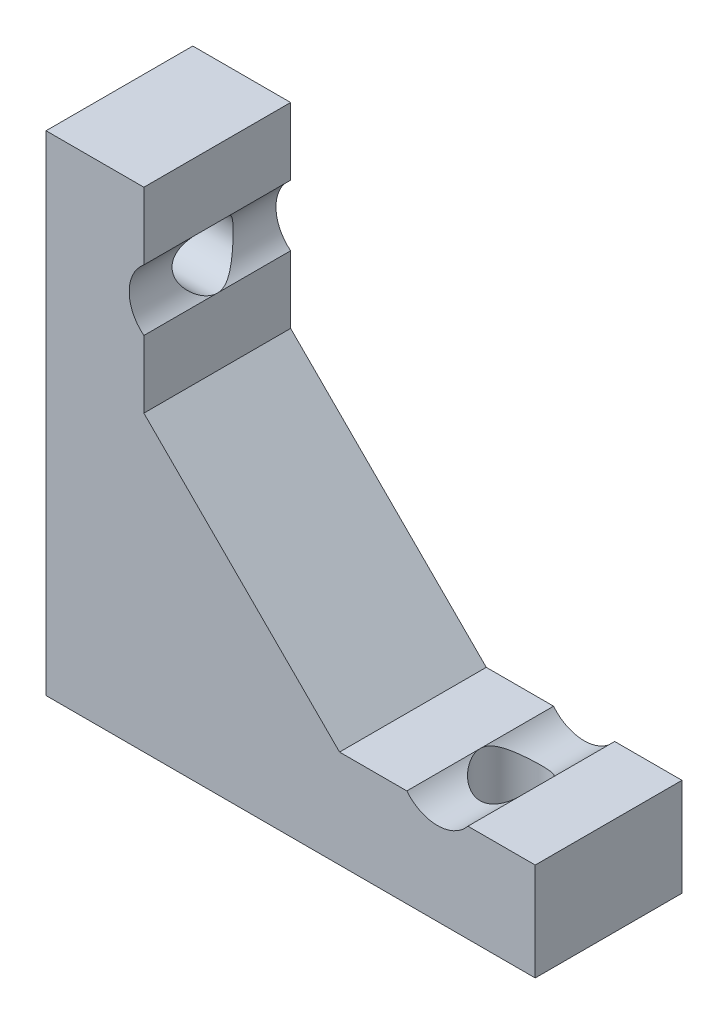
ISO-10303-21;
HEADER;
FILE_DESCRIPTION(('STEP AP214'),'2;1');
FILE_NAME('part.step','',(''),(''),'','','');
FILE_SCHEMA(('AUTOMOTIVE_DESIGN { 1 0 10303 214 1 1 1 1 }'));
ENDSEC;
DATA;
#1=APPLICATION_CONTEXT('core data for automotive mechanical design processes');
#2=APPLICATION_PROTOCOL_DEFINITION('international standard','automotive_design',2000,#1);
#3=PRODUCT_CONTEXT('',#1,'mechanical');
#4=PRODUCT('Part','Part','',(#3));
#5=PRODUCT_RELATED_PRODUCT_CATEGORY('part','',(#4));
#6=PRODUCT_DEFINITION_FORMATION('','',#4);
#7=PRODUCT_DEFINITION_CONTEXT('part definition',#1,'design');
#8=PRODUCT_DEFINITION('design','',#6,#7);
#9=PRODUCT_DEFINITION_SHAPE('','',#8);
#10=(LENGTH_UNIT() NAMED_UNIT(*) SI_UNIT(.MILLI.,.METRE.));
#11=(NAMED_UNIT(*) PLANE_ANGLE_UNIT() SI_UNIT($,.RADIAN.));
#12=(NAMED_UNIT(*) SI_UNIT($,.STERADIAN.) SOLID_ANGLE_UNIT());
#13=UNCERTAINTY_MEASURE_WITH_UNIT(LENGTH_MEASURE(1.E-05),#10,'distance_accuracy_value','');
#14=(GEOMETRIC_REPRESENTATION_CONTEXT(3) GLOBAL_UNCERTAINTY_ASSIGNED_CONTEXT((#13)) GLOBAL_UNIT_ASSIGNED_CONTEXT((#10,
#11,#12)) REPRESENTATION_CONTEXT('',''));
#15=CARTESIAN_POINT('',(0.,0.,0.));
#16=DIRECTION('',(0.,0.,1.));
#17=DIRECTION('',(1.,0.,0.));
#18=AXIS2_PLACEMENT_3D('',#15,#16,#17);
#19=CARTESIAN_POINT('',(20.,4.,6.));
#20=DIRECTION('',(0.,-1.,0.));
#21=DIRECTION('',(1.,0.,0.));
#22=AXIS2_PLACEMENT_3D('',#19,#20,#21);
#23=PLANE('',#22);
#24=DIRECTION('',(-1.,0.,0.));
#25=VECTOR('',#24,1.);
#26=CARTESIAN_POINT('',(20.,4.,0.));
#27=LINE('',#26,#25);
#28=CARTESIAN_POINT('',(20.,4.,0.));
#29=VERTEX_POINT('',#28);
#30=CARTESIAN_POINT('',(17.2489995996797,4.,0.));
#31=VERTEX_POINT('',#30);
#32=EDGE_CURVE('E281',#29,#31,#27,.T.);
#33=ORIENTED_EDGE('',*,*,#32,.T.);
#34=DIRECTION('',(0.,0.,1.));
#35=VECTOR('',#34,1.);
#36=CARTESIAN_POINT('',(17.2489995996797,4.,0.));
#37=LINE('',#36,#35);
#38=CARTESIAN_POINT('',(17.2489995996797,4.,2.95000000000002));
#39=VERTEX_POINT('',#38);
#40=EDGE_CURVE('E283',#31,#39,#37,.T.);
#41=ORIENTED_EDGE('',*,*,#40,.T.);
#42=CARTESIAN_POINT('',(16.,4.,3.));
#43=DIRECTION('',(0.,1.,0.));
#44=DIRECTION('',(-1.,0.,0.));
#45=AXIS2_PLACEMENT_3D('',#42,#43,#44);
#46=CIRCLE('',#45,1.25);
#47=CARTESIAN_POINT('',(17.2489995996797,4.,3.04999999999998));
#48=VERTEX_POINT('',#47);
#49=EDGE_CURVE('E316',#48,#39,#46,.T.);
#50=ORIENTED_EDGE('',*,*,#49,.F.);
#51=CARTESIAN_POINT('',(17.2489995996797,4.,6.));
#52=VERTEX_POINT('',#51);
#53=EDGE_CURVE('E64',#48,#52,#37,.T.);
#54=ORIENTED_EDGE('',*,*,#53,.T.);
#55=DIRECTION('',(-1.,0.,0.));
#56=VECTOR('',#55,1.);
#57=CARTESIAN_POINT('',(20.,4.,6.));
#58=LINE('',#57,#56);
#59=CARTESIAN_POINT('',(20.,4.,6.));
#60=VERTEX_POINT('',#59);
#61=EDGE_CURVE('E305',#60,#52,#58,.T.);
#62=ORIENTED_EDGE('',*,*,#61,.F.);
#63=DIRECTION('',(0.,0.,-1.));
#64=VECTOR('',#63,1.);
#65=CARTESIAN_POINT('',(20.,4.,6.));
#66=LINE('',#65,#64);
#67=EDGE_CURVE('E201',#60,#29,#66,.T.);
#68=ORIENTED_EDGE('',*,*,#67,.T.);
#69=EDGE_LOOP('',(#33,#41,#50,#54,#62,#68));
#70=FACE_BOUND('',#69,.T.);
#71=ADVANCED_FACE('F35',(#70),#23,.F.);
#72=CARTESIAN_POINT('',(4.,20.,6.));
#73=DIRECTION('',(-1.,0.,0.));
#74=DIRECTION('',(0.,-1.,0.));
#75=AXIS2_PLACEMENT_3D('',#72,#73,#74);
#76=PLANE('',#75);
#77=DIRECTION('',(0.,1.,0.));
#78=VECTOR('',#77,1.);
#79=CARTESIAN_POINT('',(4.,20.,0.));
#80=LINE('',#79,#78);
#81=CARTESIAN_POINT('',(4.,12.,0.));
#82=VERTEX_POINT('',#81);
#83=CARTESIAN_POINT('',(4.,14.7510004003203,0.));
#84=VERTEX_POINT('',#83);
#85=EDGE_CURVE('E166',#82,#84,#80,.T.);
#86=ORIENTED_EDGE('',*,*,#85,.T.);
#87=DIRECTION('',(0.,0.,1.));
#88=VECTOR('',#87,1.);
#89=CARTESIAN_POINT('',(4.,14.7510004003203,0.));
#90=LINE('',#89,#88);
#91=CARTESIAN_POINT('',(4.,14.7510004003203,2.9500000000008));
#92=VERTEX_POINT('',#91);
#93=EDGE_CURVE('E146',#84,#92,#90,.T.);
#94=ORIENTED_EDGE('',*,*,#93,.T.);
#95=CARTESIAN_POINT('',(4.,16.,3.));
#96=DIRECTION('',(1.,0.,0.));
#97=DIRECTION('',(0.,1.,0.));
#98=AXIS2_PLACEMENT_3D('',#95,#96,#97);
#99=CIRCLE('',#98,1.25);
#100=CARTESIAN_POINT('',(4.,14.7510004003203,3.0499999999992));
#101=VERTEX_POINT('',#100);
#102=EDGE_CURVE('E323',#101,#92,#99,.T.);
#103=ORIENTED_EDGE('',*,*,#102,.F.);
#104=CARTESIAN_POINT('',(4.,14.7510004003203,6.));
#105=VERTEX_POINT('',#104);
#106=EDGE_CURVE('E159',#101,#105,#90,.T.);
#107=ORIENTED_EDGE('',*,*,#106,.T.);
#108=DIRECTION('',(0.,1.,0.));
#109=VECTOR('',#108,1.);
#110=CARTESIAN_POINT('',(4.,20.,6.));
#111=LINE('',#110,#109);
#112=CARTESIAN_POINT('',(4.,12.,6.));
#113=VERTEX_POINT('',#112);
#114=EDGE_CURVE('E299',#113,#105,#111,.T.);
#115=ORIENTED_EDGE('',*,*,#114,.F.);
#116=DIRECTION('',(0.,0.,-1.));
#117=VECTOR('',#116,1.);
#118=CARTESIAN_POINT('',(4.,12.,6.));
#119=LINE('',#118,#117);
#120=EDGE_CURVE('E176',#113,#82,#119,.T.);
#121=ORIENTED_EDGE('',*,*,#120,.T.);
#122=EDGE_LOOP('',(#86,#94,#103,#107,#115,#121));
#123=FACE_BOUND('',#122,.T.);
#124=ADVANCED_FACE('F173',(#123),#76,.F.);
#125=CARTESIAN_POINT('',(0.,0.,6.));
#126=DIRECTION('',(0.,1.,0.));
#127=DIRECTION('',(0.,0.,1.));
#128=AXIS2_PLACEMENT_3D('',#125,#126,#127);
#129=PLANE('',#128);
#130=CARTESIAN_POINT('',(16.,0.,3.));
#131=DIRECTION('',(0.,1.,0.));
#132=DIRECTION('',(-1.,0.,0.));
#133=AXIS2_PLACEMENT_3D('',#130,#131,#132);
#134=CIRCLE('',#133,1.25);
#135=CARTESIAN_POINT('',(14.75,0.,3.));
#136=VERTEX_POINT('',#135);
#137=EDGE_CURVE('E295',#136,#136,#134,.T.);
#138=ORIENTED_EDGE('',*,*,#137,.T.);
#139=EDGE_LOOP('',(#138));
#140=FACE_BOUND('',#139,.T.);
#141=DIRECTION('',(1.,0.,0.));
#142=VECTOR('',#141,1.);
#143=CARTESIAN_POINT('',(0.,0.,0.));
#144=LINE('',#143,#142);
#145=CARTESIAN_POINT('',(0.,0.,0.));
#146=VERTEX_POINT('',#145);
#147=CARTESIAN_POINT('',(20.,0.,0.));
#148=VERTEX_POINT('',#147);
#149=EDGE_CURVE('E292',#146,#148,#144,.T.);
#150=ORIENTED_EDGE('',*,*,#149,.T.);
#151=DIRECTION('',(0.,0.,-1.));
#152=VECTOR('',#151,1.);
#153=CARTESIAN_POINT('',(20.,0.,6.));
#154=LINE('',#153,#152);
#155=CARTESIAN_POINT('',(20.,0.,6.));
#156=VERTEX_POINT('',#155);
#157=EDGE_CURVE('E204',#156,#148,#154,.T.);
#158=ORIENTED_EDGE('',*,*,#157,.F.);
#159=DIRECTION('',(1.,0.,0.));
#160=VECTOR('',#159,1.);
#161=CARTESIAN_POINT('',(0.,0.,6.));
#162=LINE('',#161,#160);
#163=CARTESIAN_POINT('',(0.,0.,6.));
#164=VERTEX_POINT('',#163);
#165=EDGE_CURVE('E186',#164,#156,#162,.T.);
#166=ORIENTED_EDGE('',*,*,#165,.F.);
#167=DIRECTION('',(0.,0.,-1.));
#168=VECTOR('',#167,1.);
#169=CARTESIAN_POINT('',(0.,0.,6.));
#170=LINE('',#169,#168);
#171=EDGE_CURVE('E187',#164,#146,#170,.T.);
#172=ORIENTED_EDGE('',*,*,#171,.T.);
#173=EDGE_LOOP('',(#150,#158,#166,#172));
#174=FACE_BOUND('',#173,.T.);
#175=ADVANCED_FACE('F37',(#140,#174),#129,.F.);
#176=CARTESIAN_POINT('',(20.,0.,6.));
#177=DIRECTION('',(-1.,0.,0.));
#178=DIRECTION('',(0.,0.,1.));
#179=AXIS2_PLACEMENT_3D('',#176,#177,#178);
#180=PLANE('',#179);
#181=DIRECTION('',(0.,1.,0.));
#182=VECTOR('',#181,1.);
#183=CARTESIAN_POINT('',(20.,0.,0.));
#184=LINE('',#183,#182);
#185=EDGE_CURVE('E289',#148,#29,#184,.T.);
#186=ORIENTED_EDGE('',*,*,#185,.T.);
#187=ORIENTED_EDGE('',*,*,#67,.F.);
#188=DIRECTION('',(0.,1.,0.));
#189=VECTOR('',#188,1.);
#190=CARTESIAN_POINT('',(20.,0.,6.));
#191=LINE('',#190,#189);
#192=EDGE_CURVE('E309',#156,#60,#191,.T.);
#193=ORIENTED_EDGE('',*,*,#192,.F.);
#194=ORIENTED_EDGE('',*,*,#157,.T.);
#195=EDGE_LOOP('',(#186,#187,#193,#194));
#196=FACE_BOUND('',#195,.T.);
#197=ADVANCED_FACE('F265',(#196),#180,.F.);
#198=CARTESIAN_POINT('',(14.7510004003203,4.,6.));
#199=VERTEX_POINT('',#198);
#200=CARTESIAN_POINT('',(12.,4.,6.));
#201=VERTEX_POINT('',#200);
#202=EDGE_CURVE('E308',#199,#201,#58,.T.);
#203=ORIENTED_EDGE('',*,*,#202,.F.);
#204=DIRECTION('',(0.,0.,1.));
#205=VECTOR('',#204,1.);
#206=CARTESIAN_POINT('',(14.7510004003203,4.,0.));
#207=LINE('',#206,#205);
#208=CARTESIAN_POINT('',(14.7510004003203,4.,3.04999999999998));
#209=VERTEX_POINT('',#208);
#210=EDGE_CURVE('E327',#199,#209,#207,.F.);
#211=ORIENTED_EDGE('',*,*,#210,.T.);
#212=CARTESIAN_POINT('',(14.7510004003203,4.,2.95000000000002));
#213=VERTEX_POINT('',#212);
#214=EDGE_CURVE('E313',#213,#209,#46,.T.);
#215=ORIENTED_EDGE('',*,*,#214,.F.);
#216=CARTESIAN_POINT('',(14.7510004003203,4.,0.));
#217=VERTEX_POINT('',#216);
#218=EDGE_CURVE('E56',#213,#217,#207,.F.);
#219=ORIENTED_EDGE('',*,*,#218,.T.);
#220=CARTESIAN_POINT('',(12.,4.,0.));
#221=VERTEX_POINT('',#220);
#222=EDGE_CURVE('E288',#217,#221,#27,.T.);
#223=ORIENTED_EDGE('',*,*,#222,.T.);
#224=DIRECTION('',(0.,0.,-1.));
#225=VECTOR('',#224,1.);
#226=CARTESIAN_POINT('',(12.,4.,6.));
#227=LINE('',#226,#225);
#228=EDGE_CURVE('E198',#201,#221,#227,.T.);
#229=ORIENTED_EDGE('',*,*,#228,.F.);
#230=EDGE_LOOP('',(#203,#211,#215,#219,#223,#229));
#231=FACE_BOUND('',#230,.T.);
#232=ADVANCED_FACE('F262',(#231),#23,.F.);
#233=CARTESIAN_POINT('',(4.,12.,6.));
#234=DIRECTION('',(-0.707106781186548,-0.707106781186547,0.));
#235=DIRECTION('',(0.707106781186547,-0.707106781186548,0.));
#236=AXIS2_PLACEMENT_3D('',#233,#234,#235);
#237=PLANE('',#236);
#238=DIRECTION('',(-0.707106781186548,0.707106781186548,0.));
#239=VECTOR('',#238,1.);
#240=CARTESIAN_POINT('',(4.,12.,0.));
#241=LINE('',#240,#239);
#242=EDGE_CURVE('E181',#221,#82,#241,.T.);
#243=ORIENTED_EDGE('',*,*,#242,.T.);
#244=ORIENTED_EDGE('',*,*,#120,.F.);
#245=DIRECTION('',(-0.707106781186548,0.707106781186548,0.));
#246=VECTOR('',#245,1.);
#247=CARTESIAN_POINT('',(4.,12.,6.));
#248=LINE('',#247,#246);
#249=EDGE_CURVE('E303',#201,#113,#248,.T.);
#250=ORIENTED_EDGE('',*,*,#249,.F.);
#251=ORIENTED_EDGE('',*,*,#228,.T.);
#252=EDGE_LOOP('',(#243,#244,#250,#251));
#253=FACE_BOUND('',#252,.T.);
#254=ADVANCED_FACE('F258',(#253),#237,.F.);
#255=CARTESIAN_POINT('',(4.,17.2489995996797,6.));
#256=VERTEX_POINT('',#255);
#257=CARTESIAN_POINT('',(4.,20.,6.));
#258=VERTEX_POINT('',#257);
#259=EDGE_CURVE('E302',#256,#258,#111,.T.);
#260=ORIENTED_EDGE('',*,*,#259,.F.);
#261=DIRECTION('',(0.,0.,1.));
#262=VECTOR('',#261,1.);
#263=CARTESIAN_POINT('',(4.,17.2489995996797,0.));
#264=LINE('',#263,#262);
#265=CARTESIAN_POINT('',(4.,17.2489995996797,3.0499999999985));
#266=VERTEX_POINT('',#265);
#267=EDGE_CURVE('E330',#256,#266,#264,.F.);
#268=ORIENTED_EDGE('',*,*,#267,.T.);
#269=CARTESIAN_POINT('',(4.,17.2489995996797,2.9500000000015));
#270=VERTEX_POINT('',#269);
#271=EDGE_CURVE('E320',#270,#266,#99,.T.);
#272=ORIENTED_EDGE('',*,*,#271,.F.);
#273=CARTESIAN_POINT('',(4.,17.2489995996797,0.));
#274=VERTEX_POINT('',#273);
#275=EDGE_CURVE('E157',#270,#274,#264,.F.);
#276=ORIENTED_EDGE('',*,*,#275,.T.);
#277=CARTESIAN_POINT('',(4.,20.,0.));
#278=VERTEX_POINT('',#277);
#279=EDGE_CURVE('E168',#274,#278,#80,.T.);
#280=ORIENTED_EDGE('',*,*,#279,.T.);
#281=DIRECTION('',(0.,0.,-1.));
#282=VECTOR('',#281,1.);
#283=CARTESIAN_POINT('',(4.,20.,6.));
#284=LINE('',#283,#282);
#285=EDGE_CURVE('E194',#258,#278,#284,.T.);
#286=ORIENTED_EDGE('',*,*,#285,.F.);
#287=EDGE_LOOP('',(#260,#268,#272,#276,#280,#286));
#288=FACE_BOUND('',#287,.T.);
#289=ADVANCED_FACE('F254',(#288),#76,.F.);
#290=CARTESIAN_POINT('',(0.,20.,6.));
#291=DIRECTION('',(0.,-1.,0.));
#292=DIRECTION('',(0.,0.,-1.));
#293=AXIS2_PLACEMENT_3D('',#290,#291,#292);
#294=PLANE('',#293);
#295=DIRECTION('',(-1.,0.,0.));
#296=VECTOR('',#295,1.);
#297=CARTESIAN_POINT('',(0.,20.,0.));
#298=LINE('',#297,#296);
#299=CARTESIAN_POINT('',(0.,20.,0.));
#300=VERTEX_POINT('',#299);
#301=EDGE_CURVE('E177',#278,#300,#298,.T.);
#302=ORIENTED_EDGE('',*,*,#301,.T.);
#303=DIRECTION('',(0.,0.,-1.));
#304=VECTOR('',#303,1.);
#305=CARTESIAN_POINT('',(0.,20.,6.));
#306=LINE('',#305,#304);
#307=CARTESIAN_POINT('',(0.,20.,6.));
#308=VERTEX_POINT('',#307);
#309=EDGE_CURVE('E190',#308,#300,#306,.T.);
#310=ORIENTED_EDGE('',*,*,#309,.F.);
#311=DIRECTION('',(-1.,0.,0.));
#312=VECTOR('',#311,1.);
#313=CARTESIAN_POINT('',(0.,20.,6.));
#314=LINE('',#313,#312);
#315=EDGE_CURVE('E297',#258,#308,#314,.T.);
#316=ORIENTED_EDGE('',*,*,#315,.F.);
#317=ORIENTED_EDGE('',*,*,#285,.T.);
#318=EDGE_LOOP('',(#302,#310,#316,#317));
#319=FACE_BOUND('',#318,.T.);
#320=ADVANCED_FACE('F250',(#319),#294,.F.);
#321=CARTESIAN_POINT('',(0.,0.,6.));
#322=DIRECTION('',(1.,0.,0.));
#323=DIRECTION('',(0.,0.,-1.));
#324=AXIS2_PLACEMENT_3D('',#321,#322,#323);
#325=PLANE('',#324);
#326=CARTESIAN_POINT('',(0.,16.,3.));
#327=DIRECTION('',(1.,0.,0.));
#328=DIRECTION('',(0.,1.,0.));
#329=AXIS2_PLACEMENT_3D('',#326,#327,#328);
#330=CIRCLE('',#329,1.25);
#331=CARTESIAN_POINT('',(0.,17.25,3.));
#332=VERTEX_POINT('',#331);
#333=EDGE_CURVE('E317',#332,#332,#330,.T.);
#334=ORIENTED_EDGE('',*,*,#333,.T.);
#335=EDGE_LOOP('',(#334));
#336=FACE_BOUND('',#335,.T.);
#337=DIRECTION('',(0.,-1.,0.));
#338=VECTOR('',#337,1.);
#339=CARTESIAN_POINT('',(0.,0.,0.));
#340=LINE('',#339,#338);
#341=EDGE_CURVE('E179',#300,#146,#340,.T.);
#342=ORIENTED_EDGE('',*,*,#341,.T.);
#343=ORIENTED_EDGE('',*,*,#171,.F.);
#344=DIRECTION('',(0.,-1.,0.));
#345=VECTOR('',#344,1.);
#346=CARTESIAN_POINT('',(0.,0.,6.));
#347=LINE('',#346,#345);
#348=EDGE_CURVE('E191',#308,#164,#347,.T.);
#349=ORIENTED_EDGE('',*,*,#348,.F.);
#350=ORIENTED_EDGE('',*,*,#309,.T.);
#351=EDGE_LOOP('',(#342,#343,#349,#350));
#352=FACE_BOUND('',#351,.T.);
#353=ADVANCED_FACE('F244',(#336,#352),#325,.F.);
#354=CARTESIAN_POINT('',(0.,0.,6.));
#355=DIRECTION('',(0.,0.,1.));
#356=DIRECTION('',(1.,0.,0.));
#357=AXIS2_PLACEMENT_3D('',#354,#355,#356);
#358=PLANE('',#357);
#359=CARTESIAN_POINT('',(16.,5.,6.));
#360=DIRECTION('',(0.,0.,1.));
#361=DIRECTION('',(1.,0.,0.));
#362=AXIS2_PLACEMENT_3D('',#359,#360,#361);
#363=CIRCLE('',#362,1.6);
#364=EDGE_CURVE('E169',#199,#52,#363,.T.);
#365=ORIENTED_EDGE('',*,*,#364,.F.);
#366=ORIENTED_EDGE('',*,*,#202,.T.);
#367=ORIENTED_EDGE('',*,*,#249,.T.);
#368=ORIENTED_EDGE('',*,*,#114,.T.);
#369=CARTESIAN_POINT('',(4.99999999999995,16.,6.));
#370=DIRECTION('',(0.,0.,1.));
#371=DIRECTION('',(-1.,0.,0.));
#372=AXIS2_PLACEMENT_3D('',#369,#370,#371);
#373=CIRCLE('',#372,1.6);
#374=EDGE_CURVE('E170',#256,#105,#373,.T.);
#375=ORIENTED_EDGE('',*,*,#374,.F.);
#376=ORIENTED_EDGE('',*,*,#259,.T.);
#377=ORIENTED_EDGE('',*,*,#315,.T.);
#378=ORIENTED_EDGE('',*,*,#348,.T.);
#379=ORIENTED_EDGE('',*,*,#165,.T.);
#380=ORIENTED_EDGE('',*,*,#192,.T.);
#381=ORIENTED_EDGE('',*,*,#61,.T.);
#382=EDGE_LOOP('',(#365,#366,#367,#368,#375,#376,#377,#378,#379,#380,#381));
#383=FACE_BOUND('',#382,.T.);
#384=ADVANCED_FACE('F240',(#383),#358,.T.);
#385=CARTESIAN_POINT('',(0.,0.,0.));
#386=DIRECTION('',(0.,0.,1.));
#387=DIRECTION('',(1.,0.,0.));
#388=AXIS2_PLACEMENT_3D('',#385,#386,#387);
#389=PLANE('',#388);
#390=ORIENTED_EDGE('',*,*,#222,.F.);
#391=CARTESIAN_POINT('',(16.,5.,0.));
#392=DIRECTION('',(0.,0.,1.));
#393=DIRECTION('',(1.,0.,0.));
#394=AXIS2_PLACEMENT_3D('',#391,#392,#393);
#395=CIRCLE('',#394,1.6);
#396=EDGE_CURVE('E333',#217,#31,#395,.T.);
#397=ORIENTED_EDGE('',*,*,#396,.T.);
#398=ORIENTED_EDGE('',*,*,#32,.F.);
#399=ORIENTED_EDGE('',*,*,#185,.F.);
#400=ORIENTED_EDGE('',*,*,#149,.F.);
#401=ORIENTED_EDGE('',*,*,#341,.F.);
#402=ORIENTED_EDGE('',*,*,#301,.F.);
#403=ORIENTED_EDGE('',*,*,#279,.F.);
#404=CARTESIAN_POINT('',(4.99999999999995,16.,0.));
#405=DIRECTION('',(0.,0.,1.));
#406=DIRECTION('',(-1.,0.,0.));
#407=AXIS2_PLACEMENT_3D('',#404,#405,#406);
#408=CIRCLE('',#407,1.6);
#409=EDGE_CURVE('E149',#274,#84,#408,.T.);
#410=ORIENTED_EDGE('',*,*,#409,.T.);
#411=ORIENTED_EDGE('',*,*,#85,.F.);
#412=ORIENTED_EDGE('',*,*,#242,.F.);
#413=EDGE_LOOP('',(#390,#397,#398,#399,#400,#401,#402,#403,#410,#411,#412));
#414=FACE_BOUND('',#413,.T.);
#415=ADVANCED_FACE('F164',(#414),#389,.F.);
#416=CARTESIAN_POINT('',(16.,0.,3.));
#417=DIRECTION('',(0.,1.,0.));
#418=DIRECTION('',(-1.,0.,0.));
#419=AXIS2_PLACEMENT_3D('',#416,#417,#418);
#420=CYLINDRICAL_SURFACE('',#419,1.25);
#421=ORIENTED_EDGE('',*,*,#137,.F.);
#422=EDGE_LOOP('',(#421));
#423=FACE_BOUND('',#422,.T.);
#424=ORIENTED_EDGE('',*,*,#214,.T.);
#425=CARTESIAN_POINT('',(14.7510004003203,4.,3.04999999999998));
#426=CARTESIAN_POINT('',(14.7522043548376,3.99850969064022,3.0802669605767));
#427=CARTESIAN_POINT('',(14.7545193946174,3.9956096085078,3.11037881104957));
#428=CARTESIAN_POINT('',(14.7612449208653,3.98731998522593,3.16993012806539));
#429=CARTESIAN_POINT('',(14.7656489823157,3.98193807860523,3.1993713681283));
#430=CARTESIAN_POINT('',(14.7816727440116,3.96271934613811,3.28559325036239));
#431=CARTESIAN_POINT('',(14.7961460808536,3.94574770151688,3.34115270139331));
#432=CARTESIAN_POINT('',(14.836302290871,3.90140751999869,3.46191952509712));
#433=CARTESIAN_POINT('',(14.8639234933053,3.87248211940948,3.52586774856052));
#434=CARTESIAN_POINT('',(14.9284900190879,3.81093373260921,3.6474020693957));
#435=CARTESIAN_POINT('',(14.9654954769038,3.77828767692361,3.7049435532167));
#436=CARTESIAN_POINT('',(15.0492848882697,3.71195038719373,3.81456484794477));
#437=CARTESIAN_POINT('',(15.0962901907436,3.67825342858192,3.86647213788593));
#438=CARTESIAN_POINT('',(15.1991652229569,3.61351323674027,3.96233289280929));
#439=CARTESIAN_POINT('',(15.2550099111406,3.5824628770724,4.00630809780608));
#440=CARTESIAN_POINT('',(15.3654921845754,3.53013327945597,4.07866721283114));
#441=CARTESIAN_POINT('',(15.4188615590977,3.50808597449864,4.10842268149187));
#442=CARTESIAN_POINT('',(15.5309794579184,3.46913945337325,4.16031399641026));
#443=CARTESIAN_POINT('',(15.5897266748293,3.4522389902752,4.18245168840262));
#444=CARTESIAN_POINT('',(15.7118081437364,3.42491830909755,4.21799546712767));
#445=CARTESIAN_POINT('',(15.7751740835169,3.41454871791028,4.23133337543747));
#446=CARTESIAN_POINT('',(15.9039773484986,3.40157687858733,4.24799238257989));
#447=CARTESIAN_POINT('',(15.9694128636321,3.39896802287035,4.25132200261189));
#448=CARTESIAN_POINT('',(16.0914822763901,3.40160114714713,4.2479495292034));
#449=CARTESIAN_POINT('',(16.1481768593723,3.4058865796006,4.24246976581927));
#450=CARTESIAN_POINT('',(16.2595843940922,3.42019931312141,4.22405223089725));
#451=CARTESIAN_POINT('',(16.3142970678488,3.4302274163616,4.21111341743002));
#452=CARTESIAN_POINT('',(16.4206197309732,3.45530676008006,4.17842573597733));
#453=CARTESIAN_POINT('',(16.4722179981214,3.47037573209197,4.1586528203905));
#454=CARTESIAN_POINT('',(16.5712600695131,3.5045369098791,4.11316440902793));
#455=CARTESIAN_POINT('',(16.6187030961447,3.5236298664354,4.08744780421262));
#456=CARTESIAN_POINT('',(16.7159978021258,3.56799728048948,4.02646860806833));
#457=CARTESIAN_POINT('',(16.7650783076657,3.59377125973515,3.99034363390972));
#458=CARTESIAN_POINT('',(16.8568241700391,3.6477087801164,3.91213694978772));
#459=CARTESIAN_POINT('',(16.8994798435891,3.675875830029,3.87004643045108));
#460=CARTESIAN_POINT('',(16.9866074466875,3.73901682387024,3.77094128023116));
#461=CARTESIAN_POINT('',(17.0295198006566,3.77415916509694,3.71265949185723));
#462=CARTESIAN_POINT('',(17.1052143216995,3.84195530004365,3.5884593465458));
#463=CARTESIAN_POINT('',(17.1380022071002,3.87461049063199,3.52254532934555));
#464=CARTESIAN_POINT('',(17.183050867036,3.9224636354489,3.40662335237323));
#465=CARTESIAN_POINT('',(17.1985044607919,3.93983282033805,3.35876107299885));
#466=CARTESIAN_POINT('',(17.2237014134582,3.96901470922569,3.26004334166427));
#467=CARTESIAN_POINT('',(17.2334713549342,3.98085322818102,3.20920306801116));
#468=CARTESIAN_POINT('',(17.2422968882166,3.99167963840902,3.13971232489636));
#469=CARTESIAN_POINT('',(17.2441724435887,3.99399753213791,3.12189371081996));
#470=CARTESIAN_POINT('',(17.247163034277,3.99770778443021,3.08606670787642));
#471=CARTESIAN_POINT('',(17.248276775383,3.99909856786839,3.06805804857815));
#472=CARTESIAN_POINT('',(17.2489995996797,4.,3.04999999999998));
#473=B_SPLINE_CURVE_WITH_KNOTS('',3,(#425,#426,#427,#428,#429,#430,#431,#432,#433,#434,#435,
#436,#437,#438,#439,#440,#441,#442,#443,#444,#445,#446,#447,#448,#449,#450,#451,#452,#453,#454,
#455,#456,#457,#458,#459,#460,#461,#462,#463,#464,#465,#466,#467,#468,#469,#470,#471,#472),
.UNSPECIFIED.,.F.,.F.,(4,2,2,2,2,2,2,2,2,2,2,2,2,2,2,2,2,2,2,2,2,2,2,4),(0.,0.0908649197417377,
0.181452168693351,0.360027993140666,0.585142750305534,0.811738201099246,1.04399896521168,
1.27561314925176,1.46973089776621,1.66380157971858,1.85935874433927,2.05474936157184,
2.22528270081783,2.39583986705995,2.56700339902794,2.73819889440978,2.93599496674558,
3.13408622995227,3.37450625810757,3.61479024696514,3.77392834721062,3.93231604380372,
3.98648126772953,4.04073828335764),.UNSPECIFIED.);
#474=EDGE_CURVE('E11',#209,#48,#473,.T.);
#475=ORIENTED_EDGE('',*,*,#474,.T.);
#476=ORIENTED_EDGE('',*,*,#49,.T.);
#477=CARTESIAN_POINT('',(17.2489995996797,4.,2.95000000000002));
#478=CARTESIAN_POINT('',(17.2477956451624,3.99850969064022,2.91973303942329));
#479=CARTESIAN_POINT('',(17.2454806053826,3.9956096085078,2.88962118895043));
#480=CARTESIAN_POINT('',(17.2387550791347,3.98731998522593,2.83006987193461));
#481=CARTESIAN_POINT('',(17.2343510176843,3.98193807860523,2.8006286318717));
#482=CARTESIAN_POINT('',(17.2183272559884,3.96271934613811,2.71440674963761));
#483=CARTESIAN_POINT('',(17.2038539191464,3.94574770151688,2.65884729860669));
#484=CARTESIAN_POINT('',(17.163697709129,3.90140751999869,2.53808047490288));
#485=CARTESIAN_POINT('',(17.1360765066947,3.87248211940948,2.47413225143948));
#486=CARTESIAN_POINT('',(17.0715099809121,3.81093373260921,2.3525979306043));
#487=CARTESIAN_POINT('',(17.0345045230962,3.77828767692361,2.2950564467833));
#488=CARTESIAN_POINT('',(16.9507151117303,3.71195038719373,2.18543515205523));
#489=CARTESIAN_POINT('',(16.9037098092564,3.67825342858192,2.13352786211407));
#490=CARTESIAN_POINT('',(16.8008347770431,3.61351323674027,2.03766710719071));
#491=CARTESIAN_POINT('',(16.7449900888594,3.5824628770724,1.99369190219393));
#492=CARTESIAN_POINT('',(16.6345078154246,3.53013327945597,1.92133278716886));
#493=CARTESIAN_POINT('',(16.5811384409023,3.50808597449865,1.89157731850813));
#494=CARTESIAN_POINT('',(16.4690205420816,3.46913945337325,1.83968600358974));
#495=CARTESIAN_POINT('',(16.4102733251707,3.45223899027521,1.81754831159738));
#496=CARTESIAN_POINT('',(16.2881918562636,3.42491830909755,1.78200453287233));
#497=CARTESIAN_POINT('',(16.2248259164832,3.41454871791028,1.76866662456253));
#498=CARTESIAN_POINT('',(16.0960226515014,3.40157687858733,1.75200761742011));
#499=CARTESIAN_POINT('',(16.0305871363679,3.39896802287035,1.7486779973881));
#500=CARTESIAN_POINT('',(15.9085177236099,3.40160114714713,1.7520504707966));
#501=CARTESIAN_POINT('',(15.8518231406277,3.4058865796006,1.75753023418073));
#502=CARTESIAN_POINT('',(15.7404156059078,3.42019931312141,1.77594776910274));
#503=CARTESIAN_POINT('',(15.6857029321512,3.4302274163616,1.78888658256998));
#504=CARTESIAN_POINT('',(15.5793802690268,3.45530676008006,1.82157426402267));
#505=CARTESIAN_POINT('',(15.5277820018786,3.47037573209197,1.84134717960949));
#506=CARTESIAN_POINT('',(15.4287399304869,3.50453690987909,1.88683559097207));
#507=CARTESIAN_POINT('',(15.3812969038553,3.5236298664354,1.91255219578738));
#508=CARTESIAN_POINT('',(15.2840021978743,3.56799728048948,1.97353139193166));
#509=CARTESIAN_POINT('',(15.2349216923343,3.59377125973515,2.00965636609028));
#510=CARTESIAN_POINT('',(15.143175829961,3.6477087801164,2.08786305021227));
#511=CARTESIAN_POINT('',(15.1005201564109,3.675875830029,2.12995356954891));
#512=CARTESIAN_POINT('',(15.0133925533125,3.73901682387024,2.22905871976884));
#513=CARTESIAN_POINT('',(14.9704801993434,3.77415916509694,2.28734050814277));
#514=CARTESIAN_POINT('',(14.8947856783005,3.84195530004365,2.4115406534542));
#515=CARTESIAN_POINT('',(14.8619977928998,3.87461049063198,2.47745467065444));
#516=CARTESIAN_POINT('',(14.816949132964,3.9224636354489,2.59337664762676));
#517=CARTESIAN_POINT('',(14.8014955392081,3.93983282033805,2.64123892700115));
#518=CARTESIAN_POINT('',(14.7762985865418,3.96901470922569,2.73995665833573));
#519=CARTESIAN_POINT('',(14.7665286450658,3.98085322818102,2.79079693198883));
#520=CARTESIAN_POINT('',(14.7577031117834,3.99167963840902,2.86028767510364));
#521=CARTESIAN_POINT('',(14.7558275564113,3.99399753213792,2.87810628918003));
#522=CARTESIAN_POINT('',(14.752836965723,3.99770778443021,2.91393329212358));
#523=CARTESIAN_POINT('',(14.751723224617,3.99909856786839,2.93194195142185));
#524=CARTESIAN_POINT('',(14.7510004003203,4.,2.95000000000002));
#525=B_SPLINE_CURVE_WITH_KNOTS('',3,(#477,#478,#479,#480,#481,#482,#483,#484,#485,#486,#487,
#488,#489,#490,#491,#492,#493,#494,#495,#496,#497,#498,#499,#500,#501,#502,#503,#504,#505,#506,
#507,#508,#509,#510,#511,#512,#513,#514,#515,#516,#517,#518,#519,#520,#521,#522,#523,#524),
.UNSPECIFIED.,.F.,.F.,(4,2,2,2,2,2,2,2,2,2,2,2,2,2,2,2,2,2,2,2,2,2,2,4),(0.,0.0908649197417382,
0.181452168693353,0.360027993140666,0.585142750305534,0.811738201099246,1.04399896521168,
1.27561314925175,1.46973089776621,1.66380157971857,1.85935874433926,2.05474936157183,
2.22528270081782,2.39583986705995,2.56700339902793,2.73819889440978,2.93599496674557,
3.13408622995226,3.37450625810756,3.61479024696513,3.77392834721062,3.93231604380371,
3.98648126772953,4.04073828335764),.UNSPECIFIED.);
#526=EDGE_CURVE('E49',#39,#213,#525,.T.);
#527=ORIENTED_EDGE('',*,*,#526,.T.);
#528=EDGE_LOOP('',(#424,#475,#476,#527));
#529=FACE_BOUND('',#528,.T.);
#530=ADVANCED_FACE('F235',(#423,#529),#420,.F.);
#531=CARTESIAN_POINT('',(0.,16.,3.));
#532=DIRECTION('',(1.,0.,0.));
#533=DIRECTION('',(0.,1.,0.));
#534=AXIS2_PLACEMENT_3D('',#531,#532,#533);
#535=CYLINDRICAL_SURFACE('',#534,1.25);
#536=ORIENTED_EDGE('',*,*,#333,.F.);
#537=EDGE_LOOP('',(#536));
#538=FACE_BOUND('',#537,.T.);
#539=ORIENTED_EDGE('',*,*,#102,.T.);
#540=CARTESIAN_POINT('',(4.,14.7510004003203,2.9500000000008));
#541=CARTESIAN_POINT('',(3.99850969064024,14.7522043548375,2.9197330394241));
#542=CARTESIAN_POINT('',(3.99560960850785,14.7545193946174,2.88962118895125));
#543=CARTESIAN_POINT('',(3.98731998522604,14.7612449208652,2.83006987193547));
#544=CARTESIAN_POINT('',(3.98193807860536,14.7656489823156,2.80062863187257));
#545=CARTESIAN_POINT('',(3.96271934613832,14.7816727440114,2.71440674963852));
#546=CARTESIAN_POINT('',(3.94574770151714,14.7961460808534,2.65884729860762));
#547=CARTESIAN_POINT('',(3.90140751999906,14.8363022908706,2.53808047490387));
#548=CARTESIAN_POINT('',(3.87248211940991,14.8639234933048,2.47413225144049));
#549=CARTESIAN_POINT('',(3.81093373260974,14.9284900190873,2.35259793060536));
#550=CARTESIAN_POINT('',(3.77828767692419,14.9654954769031,2.29505644678438));
#551=CARTESIAN_POINT('',(3.71195038719438,15.0492848882688,2.18543515205632));
#552=CARTESIAN_POINT('',(3.67825342858259,15.0962901907425,2.13352786211516));
#553=CARTESIAN_POINT('',(3.61351323674096,15.1991652229556,2.03766710719177));
#554=CARTESIAN_POINT('',(3.58246287707309,15.2550099111392,1.99369190219496));
#555=CARTESIAN_POINT('',(3.53013327945658,15.3654921845739,1.92133278716976));
#556=CARTESIAN_POINT('',(3.5080859744992,15.4188615590961,1.89157731850894));
#557=CARTESIAN_POINT('',(3.46913945337367,15.5309794579169,1.83968600359036));
#558=CARTESIAN_POINT('',(3.45223899027556,15.5897266748278,1.8175483115979));
#559=CARTESIAN_POINT('',(3.42491830909776,15.7118081437349,1.78200453287268));
#560=CARTESIAN_POINT('',(3.41454871791043,15.7751740835154,1.76866662456279));
#561=CARTESIAN_POINT('',(3.40157687858735,15.9039773484973,1.75200761742021));
#562=CARTESIAN_POINT('',(3.39896802287031,15.9694128636308,1.74867799738813));
#563=CARTESIAN_POINT('',(3.40160114714701,16.0914822763889,1.75205047079652));
#564=CARTESIAN_POINT('',(3.40588657960043,16.1481768593711,1.75753023418058));
#565=CARTESIAN_POINT('',(3.42019931312117,16.2595843940911,1.77594776910251));
#566=CARTESIAN_POINT('',(3.43022741636132,16.3142970678477,1.7888865825697));
#567=CARTESIAN_POINT('',(3.45530676007972,16.4206197309722,1.8215742640223));
#568=CARTESIAN_POINT('',(3.47037573209159,16.4722179981204,1.84134717960908));
#569=CARTESIAN_POINT('',(3.50453690987865,16.5712600695121,1.88683559097156));
#570=CARTESIAN_POINT('',(3.52362986643493,16.6187030961437,1.91255219578682));
#571=CARTESIAN_POINT('',(3.56799728048894,16.7159978021248,1.973531391931));
#572=CARTESIAN_POINT('',(3.59377125973457,16.7650783076648,2.00965636608955));
#573=CARTESIAN_POINT('',(3.64770878011576,16.8568241700381,2.08786305021142));
#574=CARTESIAN_POINT('',(3.67587583002833,16.8994798435882,2.12995356954799));
#575=CARTESIAN_POINT('',(3.73901682386952,16.9866074466867,2.22905871976777));
#576=CARTESIAN_POINT('',(3.7741591650962,17.0295198006558,2.28734050814161));
#577=CARTESIAN_POINT('',(3.8419553000429,17.1052143216988,2.41154065345287));
#578=CARTESIAN_POINT('',(3.87461049063125,17.1380022070995,2.47745467065302));
#579=CARTESIAN_POINT('',(3.92246363544825,17.1830508670355,2.59337664762522));
#580=CARTESIAN_POINT('',(3.93983282033745,17.1985044607915,2.64123892699958));
#581=CARTESIAN_POINT('',(3.96901470922522,17.2237014134579,2.73995665833413));
#582=CARTESIAN_POINT('',(3.98085322818062,17.2334713549339,2.79079693198722));
#583=CARTESIAN_POINT('',(3.9916796384088,17.2422968882164,2.86028767510253));
#584=CARTESIAN_POINT('',(3.99399753213778,17.2441724435886,2.87810628917943));
#585=CARTESIAN_POINT('',(3.99770778443019,17.247163034277,2.91393329212401));
#586=CARTESIAN_POINT('',(3.99909856786839,17.248276775383,2.9319419514228));
#587=CARTESIAN_POINT('',(4.,17.2489995996797,2.9500000000015));
#588=B_SPLINE_CURVE_WITH_KNOTS('',3,(#540,#541,#542,#543,#544,#545,#546,#547,#548,#549,#550,
#551,#552,#553,#554,#555,#556,#557,#558,#559,#560,#561,#562,#563,#564,#565,#566,#567,#568,#569,
#570,#571,#572,#573,#574,#575,#576,#577,#578,#579,#580,#581,#582,#583,#584,#585,#586,#587),
.UNSPECIFIED.,.F.,.F.,(4,2,2,2,2,2,2,2,2,2,2,2,2,2,2,2,2,2,2,2,2,2,2,4),(0.,0.0908649197416702,
0.181452168693217,0.360027993140396,0.585142750305038,0.811738201098521,1.04399896521073,
1.2756131492506,1.46973089776523,1.66380157971777,1.85935874433865,2.0547493615714,
2.22528270081744,2.39583986705963,2.56700339902756,2.73819889440935,2.93599496674502,
3.13408622995159,3.37450625810674,3.61479024696417,3.77392834720971,3.93231604380285,
3.98648126773023,4.04073828335991),.UNSPECIFIED.);
#589=EDGE_CURVE('E152',#92,#270,#588,.T.);
#590=ORIENTED_EDGE('',*,*,#589,.T.);
#591=ORIENTED_EDGE('',*,*,#271,.T.);
#592=CARTESIAN_POINT('',(4.,17.2489995996797,3.0499999999985));
#593=CARTESIAN_POINT('',(3.99850969064027,17.2477956451625,3.08026696057519));
#594=CARTESIAN_POINT('',(3.99560960850789,17.2454806053827,3.11037881104802));
#595=CARTESIAN_POINT('',(3.98731998522613,17.2387550791349,3.16993012806378));
#596=CARTESIAN_POINT('',(3.98193807860548,17.2343510176845,3.19937136812666));
#597=CARTESIAN_POINT('',(3.96271934613851,17.2183272559888,3.28559325036068));
#598=CARTESIAN_POINT('',(3.94574770151738,17.2038539191469,3.34115270139156));
#599=CARTESIAN_POINT('',(3.9014075199994,17.1636977091297,3.46191952509527));
#600=CARTESIAN_POINT('',(3.8724821194103,17.1360765066956,3.52586774855862));
#601=CARTESIAN_POINT('',(3.81093373261023,17.0715099809133,3.64740206939371));
#602=CARTESIAN_POINT('',(3.77828767692471,17.0345045230976,3.70494355321468));
#603=CARTESIAN_POINT('',(3.71195038719496,16.9507151117321,3.81456484794272));
#604=CARTESIAN_POINT('',(3.67825342858319,16.9037098092584,3.86647213788388));
#605=CARTESIAN_POINT('',(3.61351323674159,16.8008347770455,3.9623328928073));
#606=CARTESIAN_POINT('',(3.58246287707372,16.744990088862,4.00630809780413));
#607=CARTESIAN_POINT('',(3.53013327945715,16.6345078154274,4.07866721282945));
#608=CARTESIAN_POINT('',(3.50808597449971,16.5811384409052,4.10842268149035));
#609=CARTESIAN_POINT('',(3.46913945337407,16.4690205420845,4.1603139964091));
#610=CARTESIAN_POINT('',(3.45223899027591,16.4102733251735,4.18245168840163));
#611=CARTESIAN_POINT('',(3.424918309098,16.2881918562664,4.21799546712702));
#612=CARTESIAN_POINT('',(3.4145487179106,16.2248259164859,4.23133337543698));
#613=CARTESIAN_POINT('',(3.40157687858742,16.0960226515039,4.2479923825797));
#614=CARTESIAN_POINT('',(3.39896802287033,16.0305871363703,4.25132200261184));
#615=CARTESIAN_POINT('',(3.40160114714695,15.9085177236122,4.24794952920356));
#616=CARTESIAN_POINT('',(3.40588657960034,15.8518231406299,4.24246976581954));
#617=CARTESIAN_POINT('',(3.42019931312101,15.7404156059099,4.2240522308977));
#618=CARTESIAN_POINT('',(3.43022741636114,15.6857029321533,4.21111341743055));
#619=CARTESIAN_POINT('',(3.45530676007948,15.5793802690287,4.17842573597803));
#620=CARTESIAN_POINT('',(3.47037573209132,15.5277820018805,4.15865282039129));
#621=CARTESIAN_POINT('',(3.50453690987833,15.4287399304888,4.11316440902889));
#622=CARTESIAN_POINT('',(3.52362986643457,15.3812969038572,4.08744780421367));
#623=CARTESIAN_POINT('',(3.56799728048853,15.2840021978761,4.02646860806959));
#624=CARTESIAN_POINT('',(3.59377125973413,15.2349216923361,3.99034363391109));
#625=CARTESIAN_POINT('',(3.64770878011526,15.1431758299627,3.91213694978934));
#626=CARTESIAN_POINT('',(3.67587583002781,15.1005201564126,3.87004643045283));
#627=CARTESIAN_POINT('',(3.73901682386896,15.013392553314,3.77094128023319));
#628=CARTESIAN_POINT('',(3.77415916509562,14.970480199345,3.71265949185941));
#629=CARTESIAN_POINT('',(3.84195530004232,14.8947856783018,3.58845934654832));
#630=CARTESIAN_POINT('',(3.87461049063068,14.861997792901,3.52254532934825));
#631=CARTESIAN_POINT('',(3.92246363544777,14.816949132965,3.40662335237612));
#632=CARTESIAN_POINT('',(3.93983282033704,14.8014955392089,3.35876107300173));
#633=CARTESIAN_POINT('',(3.96901470922493,14.7762985865424,3.26004334166712));
#634=CARTESIAN_POINT('',(3.9808532281804,14.7665286450663,3.209203068014));
#635=CARTESIAN_POINT('',(3.99167963840868,14.7577031117837,3.13971232489856));
#636=CARTESIAN_POINT('',(3.99399753213769,14.7558275564115,3.12189371082158));
#637=CARTESIAN_POINT('',(3.99770778443015,14.7528369657231,3.08606670787684));
#638=CARTESIAN_POINT('',(3.99909856786837,14.751723224617,3.06805804857797));
#639=CARTESIAN_POINT('',(4.,14.7510004003203,3.0499999999992));
#640=B_SPLINE_CURVE_WITH_KNOTS('',3,(#592,#593,#594,#595,#596,#597,#598,#599,#600,#601,#602,
#603,#604,#605,#606,#607,#608,#609,#610,#611,#612,#613,#614,#615,#616,#617,#618,#619,#620,#621,
#622,#623,#624,#625,#626,#627,#628,#629,#630,#631,#632,#633,#634,#635,#636,#637,#638,#639),
.UNSPECIFIED.,.F.,.F.,(4,2,2,2,2,2,2,2,2,2,2,2,2,2,2,2,2,2,2,2,2,2,2,4),(0.,0.0908649197416124,
0.181452168693102,0.36002799314016,0.585142750304602,0.811738201097883,1.0439989652099,
1.27561314924957,1.46973089776436,1.66380157971705,1.85935874433809,2.05474936157099,
2.22528270081709,2.39583986705932,2.56700339902721,2.73819889440896,2.93599496674452,
3.13408622995098,3.374506258106,3.61479024696331,3.77392834720903,3.93231604380236,
3.98648126772998,4.04073828335991),.UNSPECIFIED.);
#641=EDGE_CURVE('E207',#266,#101,#640,.T.);
#642=ORIENTED_EDGE('',*,*,#641,.T.);
#643=EDGE_LOOP('',(#539,#590,#591,#642));
#644=FACE_BOUND('',#643,.T.);
#645=ADVANCED_FACE('F220',(#538,#644),#535,.F.);
#646=CARTESIAN_POINT('',(4.99999999999995,16.,0.));
#647=DIRECTION('',(0.,0.,1.));
#648=DIRECTION('',(1.,0.,0.));
#649=AXIS2_PLACEMENT_3D('',#646,#647,#648);
#650=CYLINDRICAL_SURFACE('',#649,1.6);
#651=ORIENTED_EDGE('',*,*,#641,.F.);
#652=ORIENTED_EDGE('',*,*,#267,.F.);
#653=ORIENTED_EDGE('',*,*,#374,.T.);
#654=ORIENTED_EDGE('',*,*,#106,.F.);
#655=EDGE_LOOP('',(#651,#652,#653,#654));
#656=FACE_BOUND('',#655,.T.);
#657=ADVANCED_FACE('F225',(#656),#650,.F.);
#658=ORIENTED_EDGE('',*,*,#409,.F.);
#659=ORIENTED_EDGE('',*,*,#275,.F.);
#660=ORIENTED_EDGE('',*,*,#589,.F.);
#661=ORIENTED_EDGE('',*,*,#93,.F.);
#662=EDGE_LOOP('',(#658,#659,#660,#661));
#663=FACE_BOUND('',#662,.T.);
#664=ADVANCED_FACE('F148',(#663),#650,.F.);
#665=CARTESIAN_POINT('',(16.,5.,0.));
#666=DIRECTION('',(0.,0.,1.));
#667=DIRECTION('',(1.,0.,0.));
#668=AXIS2_PLACEMENT_3D('',#665,#666,#667);
#669=CYLINDRICAL_SURFACE('',#668,1.6);
#670=ORIENTED_EDGE('',*,*,#396,.F.);
#671=ORIENTED_EDGE('',*,*,#218,.F.);
#672=ORIENTED_EDGE('',*,*,#526,.F.);
#673=ORIENTED_EDGE('',*,*,#40,.F.);
#674=EDGE_LOOP('',(#670,#671,#672,#673));
#675=FACE_BOUND('',#674,.T.);
#676=ADVANCED_FACE('F224',(#675),#669,.F.);
#677=ORIENTED_EDGE('',*,*,#474,.F.);
#678=ORIENTED_EDGE('',*,*,#210,.F.);
#679=ORIENTED_EDGE('',*,*,#364,.T.);
#680=ORIENTED_EDGE('',*,*,#53,.F.);
#681=EDGE_LOOP('',(#677,#678,#679,#680));
#682=FACE_BOUND('',#681,.T.);
#683=ADVANCED_FACE('F226',(#682),#669,.F.);
#684=CLOSED_SHELL('',(#71,#124,#175,#197,#232,#254,#289,#320,#353,#384,#415,#530,#645,#657,#664,
#676,#683));
#685=MANIFOLD_SOLID_BREP('B2',#684);
#686=ADVANCED_BREP_SHAPE_REPRESENTATION('',(#18,#685),#14);
#687=SHAPE_DEFINITION_REPRESENTATION(#9,#686);
ENDSEC;
END-ISO-10303-21;
